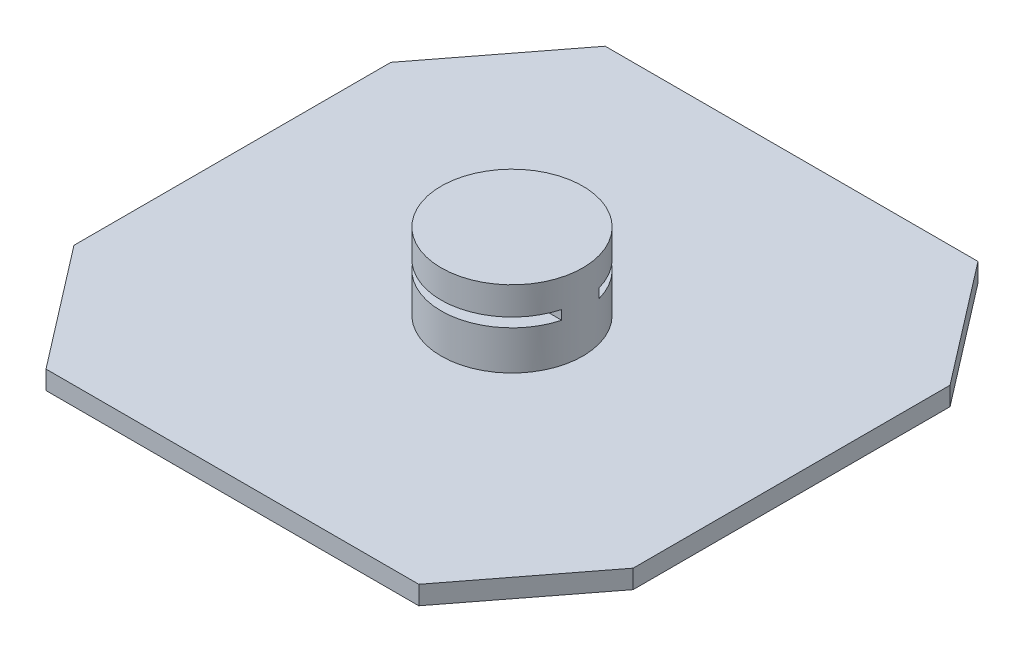
ISO-10303-21;
HEADER;
FILE_DESCRIPTION(('STEP AP214'),'2;1');
FILE_NAME('part.step','',(''),(''),'','','');
FILE_SCHEMA(('AUTOMOTIVE_DESIGN { 1 0 10303 214 1 1 1 1 }'));
ENDSEC;
DATA;
#1=APPLICATION_CONTEXT('core data for automotive mechanical design processes');
#2=APPLICATION_PROTOCOL_DEFINITION('international standard','automotive_design',2000,#1);
#3=PRODUCT_CONTEXT('',#1,'mechanical');
#4=PRODUCT('Part','Part','',(#3));
#5=PRODUCT_RELATED_PRODUCT_CATEGORY('part','',(#4));
#6=PRODUCT_DEFINITION_FORMATION('','',#4);
#7=PRODUCT_DEFINITION_CONTEXT('part definition',#1,'design');
#8=PRODUCT_DEFINITION('design','',#6,#7);
#9=PRODUCT_DEFINITION_SHAPE('','',#8);
#10=(LENGTH_UNIT() NAMED_UNIT(*) SI_UNIT(.MILLI.,.METRE.));
#11=(NAMED_UNIT(*) PLANE_ANGLE_UNIT() SI_UNIT($,.RADIAN.));
#12=(NAMED_UNIT(*) SI_UNIT($,.STERADIAN.) SOLID_ANGLE_UNIT());
#13=UNCERTAINTY_MEASURE_WITH_UNIT(LENGTH_MEASURE(1.E-05),#10,'distance_accuracy_value','');
#14=(GEOMETRIC_REPRESENTATION_CONTEXT(3) GLOBAL_UNCERTAINTY_ASSIGNED_CONTEXT((#13)) GLOBAL_UNIT_ASSIGNED_CONTEXT((#10,
#11,#12)) REPRESENTATION_CONTEXT('',''));
#15=CARTESIAN_POINT('',(0.,0.,0.));
#16=DIRECTION('',(0.,0.,1.));
#17=DIRECTION('',(1.,0.,0.));
#18=AXIS2_PLACEMENT_3D('',#15,#16,#17);
#19=CARTESIAN_POINT('',(0.,51.,0.));
#20=DIRECTION('',(0.,-1.,0.));
#21=DIRECTION('',(0.,0.,-1.));
#22=AXIS2_PLACEMENT_3D('',#19,#20,#21);
#23=CYLINDRICAL_SURFACE('',#22,38.);
#24=CARTESIAN_POINT('',(0.,36.,0.));
#25=DIRECTION('',(0.,1.,0.));
#26=DIRECTION('',(0.,0.,1.));
#27=AXIS2_PLACEMENT_3D('',#24,#25,#26);
#28=CIRCLE('',#27,38.);
#29=CARTESIAN_POINT('',(36.6606055596467,36.,-10.));
#30=VERTEX_POINT('',#29);
#31=CARTESIAN_POINT('',(-36.6606055596467,36.,-10.));
#32=VERTEX_POINT('',#31);
#33=EDGE_CURVE('E47',#30,#32,#28,.T.);
#34=ORIENTED_EDGE('',*,*,#33,.T.);
#35=DIRECTION('',(0.,-1.,0.));
#36=VECTOR('',#35,1.);
#37=CARTESIAN_POINT('',(-36.6606055596467,51.,-10.));
#38=LINE('',#37,#36);
#39=CARTESIAN_POINT('',(-36.6606055596467,31.,-10.));
#40=VERTEX_POINT('',#39);
#41=EDGE_CURVE('E11',#32,#40,#38,.T.);
#42=ORIENTED_EDGE('',*,*,#41,.T.);
#43=CARTESIAN_POINT('',(0.,31.,0.));
#44=DIRECTION('',(0.,-1.,0.));
#45=DIRECTION('',(0.,0.,-1.));
#46=AXIS2_PLACEMENT_3D('',#43,#44,#45);
#47=CIRCLE('',#46,38.);
#48=CARTESIAN_POINT('',(36.6606055596467,31.,-10.));
#49=VERTEX_POINT('',#48);
#50=EDGE_CURVE('E128',#40,#49,#47,.T.);
#51=ORIENTED_EDGE('',*,*,#50,.T.);
#52=DIRECTION('',(0.,-1.,0.));
#53=VECTOR('',#52,1.);
#54=CARTESIAN_POINT('',(36.6606055596467,51.,-10.));
#55=LINE('',#54,#53);
#56=EDGE_CURVE('E134',#49,#30,#55,.F.);
#57=ORIENTED_EDGE('',*,*,#56,.T.);
#58=EDGE_LOOP('',(#34,#42,#51,#57));
#59=FACE_BOUND('',#58,.T.);
#60=CARTESIAN_POINT('',(0.,10.,0.));
#61=DIRECTION('',(0.,1.,0.));
#62=DIRECTION('',(0.,0.,1.));
#63=AXIS2_PLACEMENT_3D('',#60,#61,#62);
#64=CIRCLE('',#63,38.);
#65=CARTESIAN_POINT('',(0.,10.,38.));
#66=VERTEX_POINT('',#65);
#67=EDGE_CURVE('E151',#66,#66,#64,.T.);
#68=ORIENTED_EDGE('',*,*,#67,.T.);
#69=EDGE_LOOP('',(#68));
#70=FACE_BOUND('',#69,.T.);
#71=CARTESIAN_POINT('',(0.,51.,0.));
#72=DIRECTION('',(0.,1.,0.));
#73=DIRECTION('',(0.,0.,1.));
#74=AXIS2_PLACEMENT_3D('',#71,#72,#73);
#75=CIRCLE('',#74,38.);
#76=CARTESIAN_POINT('',(0.,51.,38.));
#77=VERTEX_POINT('',#76);
#78=EDGE_CURVE('E195',#77,#77,#75,.T.);
#79=ORIENTED_EDGE('',*,*,#78,.F.);
#80=EDGE_LOOP('',(#79));
#81=FACE_BOUND('',#80,.T.);
#82=DIRECTION('',(0.,-1.,0.));
#83=VECTOR('',#82,1.);
#84=CARTESIAN_POINT('',(-36.6606055596467,51.,10.));
#85=LINE('',#84,#83);
#86=CARTESIAN_POINT('',(-36.6606055596467,36.,10.));
#87=VERTEX_POINT('',#86);
#88=CARTESIAN_POINT('',(-36.6606055596467,31.,10.));
#89=VERTEX_POINT('',#88);
#90=EDGE_CURVE('E143',#87,#89,#85,.T.);
#91=ORIENTED_EDGE('',*,*,#90,.F.);
#92=CARTESIAN_POINT('',(0.,36.,0.));
#93=DIRECTION('',(0.,-1.,0.));
#94=DIRECTION('',(0.,0.,-1.));
#95=AXIS2_PLACEMENT_3D('',#92,#93,#94);
#96=CIRCLE('',#95,38.);
#97=CARTESIAN_POINT('',(36.6606055596467,36.,10.));
#98=VERTEX_POINT('',#97);
#99=EDGE_CURVE('E147',#98,#87,#96,.T.);
#100=ORIENTED_EDGE('',*,*,#99,.F.);
#101=DIRECTION('',(0.,-1.,0.));
#102=VECTOR('',#101,1.);
#103=CARTESIAN_POINT('',(36.6606055596467,51.,10.));
#104=LINE('',#103,#102);
#105=CARTESIAN_POINT('',(36.6606055596467,31.,10.));
#106=VERTEX_POINT('',#105);
#107=EDGE_CURVE('E149',#106,#98,#104,.F.);
#108=ORIENTED_EDGE('',*,*,#107,.F.);
#109=CARTESIAN_POINT('',(0.,31.,0.));
#110=DIRECTION('',(0.,1.,0.));
#111=DIRECTION('',(0.,0.,1.));
#112=AXIS2_PLACEMENT_3D('',#109,#110,#111);
#113=CIRCLE('',#112,38.);
#114=EDGE_CURVE('E145',#89,#106,#113,.T.);
#115=ORIENTED_EDGE('',*,*,#114,.F.);
#116=EDGE_LOOP('',(#91,#100,#108,#115));
#117=FACE_BOUND('',#116,.T.);
#118=ADVANCED_FACE('F39',(#59,#70,#81,#117),#23,.T.);
#119=CARTESIAN_POINT('',(-100.,10.,-150.));
#120=DIRECTION('',(0.,0.,1.));
#121=DIRECTION('',(1.,0.,0.));
#122=AXIS2_PLACEMENT_3D('',#119,#120,#121);
#123=PLANE('',#122);
#124=DIRECTION('',(-1.,0.,0.));
#125=VECTOR('',#124,1.);
#126=CARTESIAN_POINT('',(-100.,0.,-150.));
#127=LINE('',#126,#125);
#128=CARTESIAN_POINT('',(100.,0.,-150.));
#129=VERTEX_POINT('',#128);
#130=CARTESIAN_POINT('',(-100.,0.,-150.));
#131=VERTEX_POINT('',#130);
#132=EDGE_CURVE('E192',#129,#131,#127,.T.);
#133=ORIENTED_EDGE('',*,*,#132,.T.);
#134=DIRECTION('',(0.,-1.,0.));
#135=VECTOR('',#134,1.);
#136=CARTESIAN_POINT('',(-100.,10.,-150.));
#137=LINE('',#136,#135);
#138=CARTESIAN_POINT('',(-100.,10.,-150.));
#139=VERTEX_POINT('',#138);
#140=EDGE_CURVE('E152',#139,#131,#137,.T.);
#141=ORIENTED_EDGE('',*,*,#140,.F.);
#142=DIRECTION('',(-1.,0.,0.));
#143=VECTOR('',#142,1.);
#144=CARTESIAN_POINT('',(-100.,10.,-150.));
#145=LINE('',#144,#143);
#146=CARTESIAN_POINT('',(100.,10.,-150.));
#147=VERTEX_POINT('',#146);
#148=EDGE_CURVE('E179',#147,#139,#145,.T.);
#149=ORIENTED_EDGE('',*,*,#148,.F.);
#150=DIRECTION('',(0.,-1.,0.));
#151=VECTOR('',#150,1.);
#152=CARTESIAN_POINT('',(100.,10.,-150.));
#153=LINE('',#152,#151);
#154=EDGE_CURVE('E173',#147,#129,#153,.T.);
#155=ORIENTED_EDGE('',*,*,#154,.T.);
#156=EDGE_LOOP('',(#133,#141,#149,#155));
#157=FACE_BOUND('',#156,.T.);
#158=ADVANCED_FACE('F41',(#157),#123,.F.);
#159=CARTESIAN_POINT('',(-100.,10.,-150.));
#160=DIRECTION('',(0.7926239891046,0.,0.609710760849692));
#161=DIRECTION('',(0.609710760849692,0.,-0.7926239891046));
#162=AXIS2_PLACEMENT_3D('',#159,#160,#161);
#163=PLANE('',#162);
#164=DIRECTION('',(-0.609710760849692,0.,0.7926239891046));
#165=VECTOR('',#164,1.);
#166=CARTESIAN_POINT('',(-100.,0.,-150.));
#167=LINE('',#166,#165);
#168=CARTESIAN_POINT('',(-150.,0.,-85.));
#169=VERTEX_POINT('',#168);
#170=EDGE_CURVE('E190',#131,#169,#167,.T.);
#171=ORIENTED_EDGE('',*,*,#170,.T.);
#172=DIRECTION('',(0.,-1.,0.));
#173=VECTOR('',#172,1.);
#174=CARTESIAN_POINT('',(-150.,10.,-85.));
#175=LINE('',#174,#173);
#176=CARTESIAN_POINT('',(-150.,10.,-85.));
#177=VERTEX_POINT('',#176);
#178=EDGE_CURVE('E155',#177,#169,#175,.T.);
#179=ORIENTED_EDGE('',*,*,#178,.F.);
#180=DIRECTION('',(-0.609710760849692,0.,0.7926239891046));
#181=VECTOR('',#180,1.);
#182=CARTESIAN_POINT('',(-100.,10.,-150.));
#183=LINE('',#182,#181);
#184=EDGE_CURVE('E207',#139,#177,#183,.T.);
#185=ORIENTED_EDGE('',*,*,#184,.F.);
#186=ORIENTED_EDGE('',*,*,#140,.T.);
#187=EDGE_LOOP('',(#171,#179,#185,#186));
#188=FACE_BOUND('',#187,.T.);
#189=ADVANCED_FACE('F236',(#188),#163,.F.);
#190=CARTESIAN_POINT('',(-150.,10.,85.));
#191=DIRECTION('',(1.,0.,0.));
#192=DIRECTION('',(0.,0.,-1.));
#193=AXIS2_PLACEMENT_3D('',#190,#191,#192);
#194=PLANE('',#193);
#195=DIRECTION('',(0.,0.,1.));
#196=VECTOR('',#195,1.);
#197=CARTESIAN_POINT('',(-150.,0.,85.));
#198=LINE('',#197,#196);
#199=CARTESIAN_POINT('',(-150.,0.,85.));
#200=VERTEX_POINT('',#199);
#201=EDGE_CURVE('E188',#169,#200,#198,.T.);
#202=ORIENTED_EDGE('',*,*,#201,.T.);
#203=DIRECTION('',(0.,-1.,0.));
#204=VECTOR('',#203,1.);
#205=CARTESIAN_POINT('',(-150.,10.,85.));
#206=LINE('',#205,#204);
#207=CARTESIAN_POINT('',(-150.,10.,85.));
#208=VERTEX_POINT('',#207);
#209=EDGE_CURVE('E158',#208,#200,#206,.T.);
#210=ORIENTED_EDGE('',*,*,#209,.F.);
#211=DIRECTION('',(0.,0.,1.));
#212=VECTOR('',#211,1.);
#213=CARTESIAN_POINT('',(-150.,10.,85.));
#214=LINE('',#213,#212);
#215=EDGE_CURVE('E205',#177,#208,#214,.T.);
#216=ORIENTED_EDGE('',*,*,#215,.F.);
#217=ORIENTED_EDGE('',*,*,#178,.T.);
#218=EDGE_LOOP('',(#202,#210,#216,#217));
#219=FACE_BOUND('',#218,.T.);
#220=ADVANCED_FACE('F269',(#219),#194,.F.);
#221=CARTESIAN_POINT('',(-150.,10.,85.));
#222=DIRECTION('',(0.7926239891046,0.,-0.609710760849692));
#223=DIRECTION('',(-0.609710760849693,0.,-0.7926239891046));
#224=AXIS2_PLACEMENT_3D('',#221,#222,#223);
#225=PLANE('',#224);
#226=DIRECTION('',(0.609710760849692,0.,0.7926239891046));
#227=VECTOR('',#226,1.);
#228=CARTESIAN_POINT('',(-150.,0.,85.));
#229=LINE('',#228,#227);
#230=CARTESIAN_POINT('',(-100.,0.,150.));
#231=VERTEX_POINT('',#230);
#232=EDGE_CURVE('E186',#200,#231,#229,.T.);
#233=ORIENTED_EDGE('',*,*,#232,.T.);
#234=DIRECTION('',(0.,-1.,0.));
#235=VECTOR('',#234,1.);
#236=CARTESIAN_POINT('',(-100.,10.,150.));
#237=LINE('',#236,#235);
#238=CARTESIAN_POINT('',(-100.,10.,150.));
#239=VERTEX_POINT('',#238);
#240=EDGE_CURVE('E161',#239,#231,#237,.T.);
#241=ORIENTED_EDGE('',*,*,#240,.F.);
#242=DIRECTION('',(0.609710760849692,0.,0.7926239891046));
#243=VECTOR('',#242,1.);
#244=CARTESIAN_POINT('',(-150.,10.,85.));
#245=LINE('',#244,#243);
#246=EDGE_CURVE('E203',#208,#239,#245,.T.);
#247=ORIENTED_EDGE('',*,*,#246,.F.);
#248=ORIENTED_EDGE('',*,*,#209,.T.);
#249=EDGE_LOOP('',(#233,#241,#247,#248));
#250=FACE_BOUND('',#249,.T.);
#251=ADVANCED_FACE('F265',(#250),#225,.F.);
#252=CARTESIAN_POINT('',(100.,10.,150.));
#253=DIRECTION('',(0.,0.,-1.));
#254=DIRECTION('',(-1.,0.,0.));
#255=AXIS2_PLACEMENT_3D('',#252,#253,#254);
#256=PLANE('',#255);
#257=DIRECTION('',(1.,0.,0.));
#258=VECTOR('',#257,1.);
#259=CARTESIAN_POINT('',(100.,0.,150.));
#260=LINE('',#259,#258);
#261=CARTESIAN_POINT('',(100.,0.,150.));
#262=VERTEX_POINT('',#261);
#263=EDGE_CURVE('E184',#231,#262,#260,.T.);
#264=ORIENTED_EDGE('',*,*,#263,.T.);
#265=DIRECTION('',(0.,-1.,0.));
#266=VECTOR('',#265,1.);
#267=CARTESIAN_POINT('',(100.,10.,150.));
#268=LINE('',#267,#266);
#269=CARTESIAN_POINT('',(100.,10.,150.));
#270=VERTEX_POINT('',#269);
#271=EDGE_CURVE('E164',#270,#262,#268,.T.);
#272=ORIENTED_EDGE('',*,*,#271,.F.);
#273=DIRECTION('',(1.,0.,0.));
#274=VECTOR('',#273,1.);
#275=CARTESIAN_POINT('',(100.,10.,150.));
#276=LINE('',#275,#274);
#277=EDGE_CURVE('E201',#239,#270,#276,.T.);
#278=ORIENTED_EDGE('',*,*,#277,.F.);
#279=ORIENTED_EDGE('',*,*,#240,.T.);
#280=EDGE_LOOP('',(#264,#272,#278,#279));
#281=FACE_BOUND('',#280,.T.);
#282=ADVANCED_FACE('F261',(#281),#256,.F.);
#283=CARTESIAN_POINT('',(150.,10.,85.));
#284=DIRECTION('',(-0.7926239891046,0.,-0.609710760849692));
#285=DIRECTION('',(-0.609710760849692,0.,0.7926239891046));
#286=AXIS2_PLACEMENT_3D('',#283,#284,#285);
#287=PLANE('',#286);
#288=DIRECTION('',(0.609710760849692,0.,-0.7926239891046));
#289=VECTOR('',#288,1.);
#290=CARTESIAN_POINT('',(150.,0.,85.));
#291=LINE('',#290,#289);
#292=CARTESIAN_POINT('',(150.,0.,85.));
#293=VERTEX_POINT('',#292);
#294=EDGE_CURVE('E182',#262,#293,#291,.T.);
#295=ORIENTED_EDGE('',*,*,#294,.T.);
#296=DIRECTION('',(0.,-1.,0.));
#297=VECTOR('',#296,1.);
#298=CARTESIAN_POINT('',(150.,10.,85.));
#299=LINE('',#298,#297);
#300=CARTESIAN_POINT('',(150.,10.,85.));
#301=VERTEX_POINT('',#300);
#302=EDGE_CURVE('E167',#301,#293,#299,.T.);
#303=ORIENTED_EDGE('',*,*,#302,.F.);
#304=DIRECTION('',(0.609710760849692,0.,-0.7926239891046));
#305=VECTOR('',#304,1.);
#306=CARTESIAN_POINT('',(150.,10.,85.));
#307=LINE('',#306,#305);
#308=EDGE_CURVE('E199',#270,#301,#307,.T.);
#309=ORIENTED_EDGE('',*,*,#308,.F.);
#310=ORIENTED_EDGE('',*,*,#271,.T.);
#311=EDGE_LOOP('',(#295,#303,#309,#310));
#312=FACE_BOUND('',#311,.T.);
#313=ADVANCED_FACE('F257',(#312),#287,.F.);
#314=CARTESIAN_POINT('',(150.,10.,-85.));
#315=DIRECTION('',(-1.,0.,0.));
#316=DIRECTION('',(0.,0.,1.));
#317=AXIS2_PLACEMENT_3D('',#314,#315,#316);
#318=PLANE('',#317);
#319=DIRECTION('',(0.,0.,-1.));
#320=VECTOR('',#319,1.);
#321=CARTESIAN_POINT('',(150.,0.,-85.));
#322=LINE('',#321,#320);
#323=CARTESIAN_POINT('',(150.,0.,-85.));
#324=VERTEX_POINT('',#323);
#325=EDGE_CURVE('E180',#293,#324,#322,.T.);
#326=ORIENTED_EDGE('',*,*,#325,.T.);
#327=DIRECTION('',(0.,-1.,0.));
#328=VECTOR('',#327,1.);
#329=CARTESIAN_POINT('',(150.,10.,-85.));
#330=LINE('',#329,#328);
#331=CARTESIAN_POINT('',(150.,10.,-85.));
#332=VERTEX_POINT('',#331);
#333=EDGE_CURVE('E170',#332,#324,#330,.T.);
#334=ORIENTED_EDGE('',*,*,#333,.F.);
#335=DIRECTION('',(0.,0.,-1.));
#336=VECTOR('',#335,1.);
#337=CARTESIAN_POINT('',(150.,10.,-85.));
#338=LINE('',#337,#336);
#339=EDGE_CURVE('E197',#301,#332,#338,.T.);
#340=ORIENTED_EDGE('',*,*,#339,.F.);
#341=ORIENTED_EDGE('',*,*,#302,.T.);
#342=EDGE_LOOP('',(#326,#334,#340,#341));
#343=FACE_BOUND('',#342,.T.);
#344=ADVANCED_FACE('F253',(#343),#318,.F.);
#345=CARTESIAN_POINT('',(100.,10.,-150.));
#346=DIRECTION('',(-0.7926239891046,0.,0.609710760849692));
#347=DIRECTION('',(0.609710760849692,0.,0.7926239891046));
#348=AXIS2_PLACEMENT_3D('',#345,#346,#347);
#349=PLANE('',#348);
#350=DIRECTION('',(-0.609710760849692,0.,-0.7926239891046));
#351=VECTOR('',#350,1.);
#352=CARTESIAN_POINT('',(100.,0.,-150.));
#353=LINE('',#352,#351);
#354=EDGE_CURVE('E177',#324,#129,#353,.T.);
#355=ORIENTED_EDGE('',*,*,#354,.T.);
#356=ORIENTED_EDGE('',*,*,#154,.F.);
#357=DIRECTION('',(-0.609710760849692,0.,-0.7926239891046));
#358=VECTOR('',#357,1.);
#359=CARTESIAN_POINT('',(100.,10.,-150.));
#360=LINE('',#359,#358);
#361=EDGE_CURVE('E176',#332,#147,#360,.T.);
#362=ORIENTED_EDGE('',*,*,#361,.F.);
#363=ORIENTED_EDGE('',*,*,#333,.T.);
#364=EDGE_LOOP('',(#355,#356,#362,#363));
#365=FACE_BOUND('',#364,.T.);
#366=ADVANCED_FACE('F246',(#365),#349,.F.);
#367=CARTESIAN_POINT('',(0.,10.,0.));
#368=DIRECTION('',(0.,-1.,0.));
#369=DIRECTION('',(0.,0.,-1.));
#370=AXIS2_PLACEMENT_3D('',#367,#368,#369);
#371=PLANE('',#370);
#372=ORIENTED_EDGE('',*,*,#67,.F.);
#373=EDGE_LOOP('',(#372));
#374=FACE_BOUND('',#373,.T.);
#375=ORIENTED_EDGE('',*,*,#148,.T.);
#376=ORIENTED_EDGE('',*,*,#184,.T.);
#377=ORIENTED_EDGE('',*,*,#215,.T.);
#378=ORIENTED_EDGE('',*,*,#246,.T.);
#379=ORIENTED_EDGE('',*,*,#277,.T.);
#380=ORIENTED_EDGE('',*,*,#308,.T.);
#381=ORIENTED_EDGE('',*,*,#339,.T.);
#382=ORIENTED_EDGE('',*,*,#361,.T.);
#383=EDGE_LOOP('',(#375,#376,#377,#378,#379,#380,#381,#382));
#384=FACE_BOUND('',#383,.T.);
#385=ADVANCED_FACE('F242',(#374,#384),#371,.F.);
#386=CARTESIAN_POINT('',(0.,0.,0.));
#387=DIRECTION('',(0.,-1.,0.));
#388=DIRECTION('',(0.,0.,-1.));
#389=AXIS2_PLACEMENT_3D('',#386,#387,#388);
#390=PLANE('',#389);
#391=ORIENTED_EDGE('',*,*,#132,.F.);
#392=ORIENTED_EDGE('',*,*,#354,.F.);
#393=ORIENTED_EDGE('',*,*,#325,.F.);
#394=ORIENTED_EDGE('',*,*,#294,.F.);
#395=ORIENTED_EDGE('',*,*,#263,.F.);
#396=ORIENTED_EDGE('',*,*,#232,.F.);
#397=ORIENTED_EDGE('',*,*,#201,.F.);
#398=ORIENTED_EDGE('',*,*,#170,.F.);
#399=EDGE_LOOP('',(#391,#392,#393,#394,#395,#396,#397,#398));
#400=FACE_BOUND('',#399,.T.);
#401=ADVANCED_FACE('F245',(#400),#390,.T.);
#402=CARTESIAN_POINT('',(0.,51.,0.));
#403=DIRECTION('',(0.,1.,0.));
#404=DIRECTION('',(0.,0.,1.));
#405=AXIS2_PLACEMENT_3D('',#402,#403,#404);
#406=PLANE('',#405);
#407=ORIENTED_EDGE('',*,*,#78,.T.);
#408=EDGE_LOOP('',(#407));
#409=FACE_BOUND('',#408,.T.);
#410=ADVANCED_FACE('F240',(#409),#406,.T.);
#411=CARTESIAN_POINT('',(-38.,31.,59.9999999999999));
#412=DIRECTION('',(0.,1.,0.));
#413=DIRECTION('',(0.,0.,1.));
#414=AXIS2_PLACEMENT_3D('',#411,#412,#413);
#415=PLANE('',#414);
#416=ORIENTED_EDGE('',*,*,#114,.T.);
#417=DIRECTION('',(1.,0.,0.));
#418=VECTOR('',#417,1.);
#419=CARTESIAN_POINT('',(-38.,31.,10.));
#420=LINE('',#419,#418);
#421=EDGE_CURVE('E62',#89,#106,#420,.T.);
#422=ORIENTED_EDGE('',*,*,#421,.F.);
#423=EDGE_LOOP('',(#416,#422));
#424=FACE_BOUND('',#423,.T.);
#425=ADVANCED_FACE('F349',(#424),#415,.T.);
#426=CARTESIAN_POINT('',(-38.,36.,59.9999999999999));
#427=DIRECTION('',(0.,-1.,0.));
#428=DIRECTION('',(0.,0.,-1.));
#429=AXIS2_PLACEMENT_3D('',#426,#427,#428);
#430=PLANE('',#429);
#431=ORIENTED_EDGE('',*,*,#99,.T.);
#432=DIRECTION('',(-1.,0.,0.));
#433=VECTOR('',#432,1.);
#434=CARTESIAN_POINT('',(-38.,36.,10.));
#435=LINE('',#434,#433);
#436=EDGE_CURVE('E215',#98,#87,#435,.T.);
#437=ORIENTED_EDGE('',*,*,#436,.F.);
#438=EDGE_LOOP('',(#431,#437));
#439=FACE_BOUND('',#438,.T.);
#440=ADVANCED_FACE('F229',(#439),#430,.T.);
#441=CARTESIAN_POINT('',(0.,0.,10.));
#442=DIRECTION('',(0.,0.,1.));
#443=DIRECTION('',(1.,0.,0.));
#444=AXIS2_PLACEMENT_3D('',#441,#442,#443);
#445=PLANE('',#444);
#446=ORIENTED_EDGE('',*,*,#90,.T.);
#447=ORIENTED_EDGE('',*,*,#421,.T.);
#448=ORIENTED_EDGE('',*,*,#107,.T.);
#449=ORIENTED_EDGE('',*,*,#436,.T.);
#450=EDGE_LOOP('',(#446,#447,#448,#449));
#451=FACE_BOUND('',#450,.T.);
#452=ADVANCED_FACE('F221',(#451),#445,.T.);
#453=CARTESIAN_POINT('',(38.,36.,-51.));
#454=DIRECTION('',(0.,1.,0.));
#455=DIRECTION('',(0.,0.,1.));
#456=AXIS2_PLACEMENT_3D('',#453,#454,#455);
#457=PLANE('',#456);
#458=DIRECTION('',(-1.,0.,0.));
#459=VECTOR('',#458,1.);
#460=CARTESIAN_POINT('',(38.,36.,-10.));
#461=LINE('',#460,#459);
#462=EDGE_CURVE('E54',#30,#32,#461,.T.);
#463=ORIENTED_EDGE('',*,*,#462,.T.);
#464=ORIENTED_EDGE('',*,*,#33,.F.);
#465=EDGE_LOOP('',(#463,#464));
#466=FACE_BOUND('',#465,.T.);
#467=ADVANCED_FACE('F219',(#466),#457,.F.);
#468=CARTESIAN_POINT('',(-38.,31.,-51.));
#469=DIRECTION('',(0.,-1.,0.));
#470=DIRECTION('',(0.,0.,-1.));
#471=AXIS2_PLACEMENT_3D('',#468,#469,#470);
#472=PLANE('',#471);
#473=DIRECTION('',(1.,0.,0.));
#474=VECTOR('',#473,1.);
#475=CARTESIAN_POINT('',(-38.,31.,-10.));
#476=LINE('',#475,#474);
#477=EDGE_CURVE('E131',#40,#49,#476,.T.);
#478=ORIENTED_EDGE('',*,*,#477,.T.);
#479=ORIENTED_EDGE('',*,*,#50,.F.);
#480=EDGE_LOOP('',(#478,#479));
#481=FACE_BOUND('',#480,.T.);
#482=ADVANCED_FACE('F130',(#481),#472,.F.);
#483=CARTESIAN_POINT('',(0.,0.,-10.));
#484=DIRECTION('',(0.,0.,1.));
#485=DIRECTION('',(1.,0.,0.));
#486=AXIS2_PLACEMENT_3D('',#483,#484,#485);
#487=PLANE('',#486);
#488=ORIENTED_EDGE('',*,*,#462,.F.);
#489=ORIENTED_EDGE('',*,*,#56,.F.);
#490=ORIENTED_EDGE('',*,*,#477,.F.);
#491=ORIENTED_EDGE('',*,*,#41,.F.);
#492=EDGE_LOOP('',(#488,#489,#490,#491));
#493=FACE_BOUND('',#492,.T.);
#494=ADVANCED_FACE('F136',(#493),#487,.F.);
#495=CLOSED_SHELL('',(#118,#158,#189,#220,#251,#282,#313,#344,#366,#385,#401,#410,#425,#440,
#452,#467,#482,#494));
#496=MANIFOLD_SOLID_BREP('B2',#495);
#497=ADVANCED_BREP_SHAPE_REPRESENTATION('',(#18,#496),#14);
#498=SHAPE_DEFINITION_REPRESENTATION(#9,#497);
ENDSEC;
END-ISO-10303-21;
